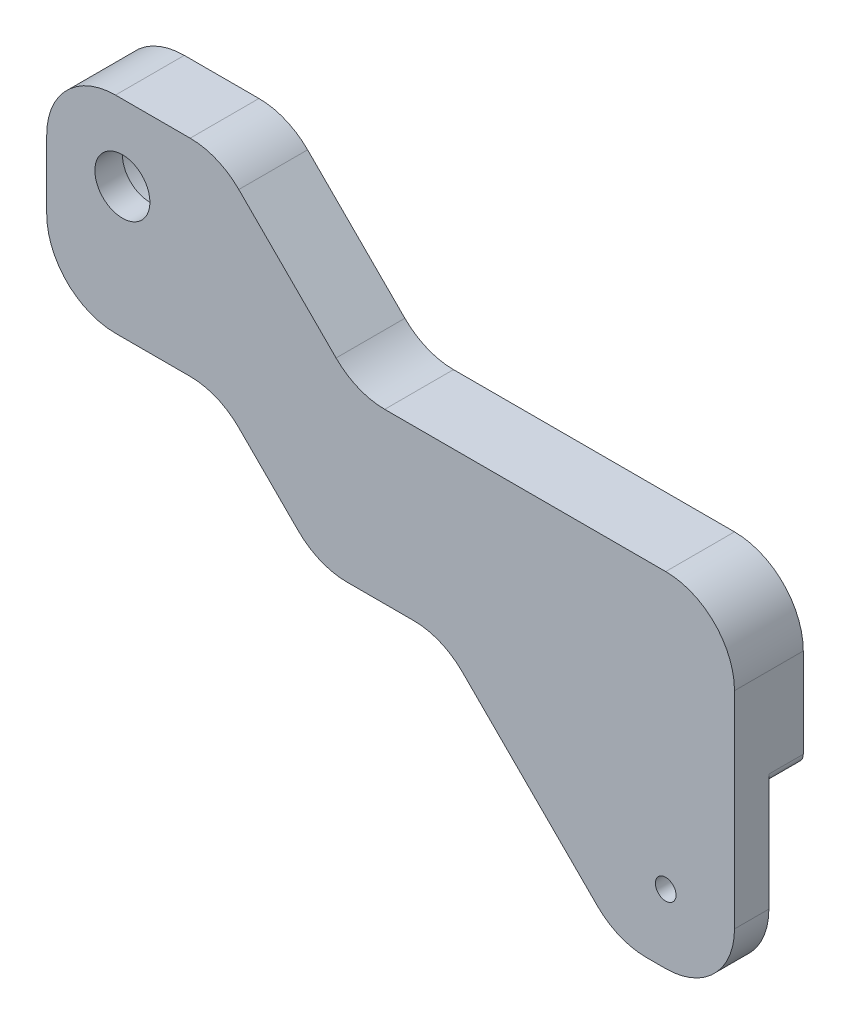
ISO-10303-21;
HEADER;
FILE_DESCRIPTION(('STEP AP214'),'2;1');
FILE_NAME('part.step','',(''),(''),'','','');
FILE_SCHEMA(('AUTOMOTIVE_DESIGN { 1 0 10303 214 1 1 1 1 }'));
ENDSEC;
DATA;
#1=APPLICATION_CONTEXT('core data for automotive mechanical design processes');
#2=APPLICATION_PROTOCOL_DEFINITION('international standard','automotive_design',2000,#1);
#3=PRODUCT_CONTEXT('',#1,'mechanical');
#4=PRODUCT('Part','Part','',(#3));
#5=PRODUCT_RELATED_PRODUCT_CATEGORY('part','',(#4));
#6=PRODUCT_DEFINITION_FORMATION('','',#4);
#7=PRODUCT_DEFINITION_CONTEXT('part definition',#1,'design');
#8=PRODUCT_DEFINITION('design','',#6,#7);
#9=PRODUCT_DEFINITION_SHAPE('','',#8);
#10=(LENGTH_UNIT() NAMED_UNIT(*) SI_UNIT(.MILLI.,.METRE.));
#11=(NAMED_UNIT(*) PLANE_ANGLE_UNIT() SI_UNIT($,.RADIAN.));
#12=(NAMED_UNIT(*) SI_UNIT($,.STERADIAN.) SOLID_ANGLE_UNIT());
#13=UNCERTAINTY_MEASURE_WITH_UNIT(LENGTH_MEASURE(1.E-05),#10,'distance_accuracy_value','');
#14=(GEOMETRIC_REPRESENTATION_CONTEXT(3) GLOBAL_UNCERTAINTY_ASSIGNED_CONTEXT((#13)) GLOBAL_UNIT_ASSIGNED_CONTEXT((#10,
#11,#12)) REPRESENTATION_CONTEXT('',''));
#15=CARTESIAN_POINT('',(0.,0.,0.));
#16=DIRECTION('',(0.,0.,1.));
#17=DIRECTION('',(1.,0.,0.));
#18=AXIS2_PLACEMENT_3D('',#15,#16,#17);
#19=CARTESIAN_POINT('',(22.,118.,20.));
#20=DIRECTION('',(0.,0.,-1.));
#21=DIRECTION('',(-1.,0.,0.));
#22=AXIS2_PLACEMENT_3D('',#19,#20,#21);
#23=CYLINDRICAL_SURFACE('',#22,8.00000000000001);
#24=CARTESIAN_POINT('',(22.,118.,20.));
#25=DIRECTION('',(0.,0.,-1.));
#26=DIRECTION('',(-1.,0.,0.));
#27=AXIS2_PLACEMENT_3D('',#24,#25,#26);
#28=CIRCLE('',#27,8.00000000000001);
#29=CARTESIAN_POINT('',(14.,118.,20.));
#30=VERTEX_POINT('',#29);
#31=EDGE_CURVE('E256',#30,#30,#28,.T.);
#32=ORIENTED_EDGE('',*,*,#31,.F.);
#33=EDGE_LOOP('',(#32));
#34=FACE_BOUND('',#33,.T.);
#35=CARTESIAN_POINT('',(22.,118.,12.));
#36=DIRECTION('',(0.,0.,-1.));
#37=DIRECTION('',(-1.,0.,0.));
#38=AXIS2_PLACEMENT_3D('',#35,#36,#37);
#39=CIRCLE('',#38,8.00000000000001);
#40=CARTESIAN_POINT('',(14.,118.,12.));
#41=VERTEX_POINT('',#40);
#42=EDGE_CURVE('E253',#41,#41,#39,.F.);
#43=ORIENTED_EDGE('',*,*,#42,.F.);
#44=EDGE_LOOP('',(#43));
#45=FACE_BOUND('',#44,.T.);
#46=ADVANCED_FACE('F33',(#34,#45),#23,.F.);
#47=CARTESIAN_POINT('',(0.,0.,20.));
#48=DIRECTION('',(1.,0.,0.));
#49=DIRECTION('',(0.,0.,-1.));
#50=AXIS2_PLACEMENT_3D('',#47,#48,#49);
#51=PLANE('',#50);
#52=DIRECTION('',(0.,-1.,0.));
#53=VECTOR('',#52,1.);
#54=CARTESIAN_POINT('',(0.,0.,20.));
#55=LINE('',#54,#53);
#56=CARTESIAN_POINT('',(0.,120.,20.));
#57=VERTEX_POINT('',#56);
#58=CARTESIAN_POINT('',(0.,100.,20.));
#59=VERTEX_POINT('',#58);
#60=EDGE_CURVE('E236',#57,#59,#55,.T.);
#61=ORIENTED_EDGE('',*,*,#60,.F.);
#62=DIRECTION('',(0.,0.,1.));
#63=VECTOR('',#62,1.);
#64=CARTESIAN_POINT('',(0.,120.,0.));
#65=LINE('',#64,#63);
#66=CARTESIAN_POINT('',(0.,120.,0.));
#67=VERTEX_POINT('',#66);
#68=EDGE_CURVE('E307',#57,#67,#65,.F.);
#69=ORIENTED_EDGE('',*,*,#68,.T.);
#70=DIRECTION('',(0.,-1.,0.));
#71=VECTOR('',#70,1.);
#72=CARTESIAN_POINT('',(0.,0.,0.));
#73=LINE('',#72,#71);
#74=CARTESIAN_POINT('',(0.,100.,0.));
#75=VERTEX_POINT('',#74);
#76=EDGE_CURVE('E235',#67,#75,#73,.T.);
#77=ORIENTED_EDGE('',*,*,#76,.T.);
#78=DIRECTION('',(0.,0.,1.));
#79=VECTOR('',#78,1.);
#80=CARTESIAN_POINT('',(0.,100.,20.));
#81=LINE('',#80,#79);
#82=EDGE_CURVE('E304',#75,#59,#81,.T.);
#83=ORIENTED_EDGE('',*,*,#82,.T.);
#84=EDGE_LOOP('',(#61,#69,#77,#83));
#85=FACE_BOUND('',#84,.T.);
#86=ADVANCED_FACE('F439',(#85),#51,.F.);
#87=CARTESIAN_POINT('',(0.,0.,20.));
#88=DIRECTION('',(0.,1.,0.));
#89=DIRECTION('',(0.,0.,1.));
#90=AXIS2_PLACEMENT_3D('',#87,#88,#89);
#91=PLANE('',#90);
#92=DIRECTION('',(-1.,0.,0.));
#93=VECTOR('',#92,1.);
#94=CARTESIAN_POINT('',(200.,0.,10.));
#95=LINE('',#94,#93);
#96=CARTESIAN_POINT('',(180.,0.,10.));
#97=VERTEX_POINT('',#96);
#98=CARTESIAN_POINT('',(174.284271247462,0.,10.));
#99=VERTEX_POINT('',#98);
#100=EDGE_CURVE('E214',#97,#99,#95,.T.);
#101=ORIENTED_EDGE('',*,*,#100,.F.);
#102=DIRECTION('',(0.,0.,-1.));
#103=VECTOR('',#102,1.);
#104=CARTESIAN_POINT('',(180.,0.,20.));
#105=LINE('',#104,#103);
#106=CARTESIAN_POINT('',(180.,0.,20.));
#107=VERTEX_POINT('',#106);
#108=EDGE_CURVE('E187',#97,#107,#105,.F.);
#109=ORIENTED_EDGE('',*,*,#108,.T.);
#110=DIRECTION('',(1.,0.,0.));
#111=VECTOR('',#110,1.);
#112=CARTESIAN_POINT('',(0.,0.,20.));
#113=LINE('',#112,#111);
#114=CARTESIAN_POINT('',(174.284271247462,0.,20.));
#115=VERTEX_POINT('',#114);
#116=EDGE_CURVE('E239',#115,#107,#113,.T.);
#117=ORIENTED_EDGE('',*,*,#116,.F.);
#118=DIRECTION('',(0.,0.,-1.));
#119=VECTOR('',#118,1.);
#120=CARTESIAN_POINT('',(174.284271247462,0.,20.));
#121=LINE('',#120,#119);
#122=EDGE_CURVE('E192',#115,#99,#121,.T.);
#123=ORIENTED_EDGE('',*,*,#122,.T.);
#124=EDGE_LOOP('',(#101,#109,#117,#123));
#125=FACE_BOUND('',#124,.T.);
#126=ADVANCED_FACE('F359',(#125),#91,.F.);
#127=CARTESIAN_POINT('',(200.,0.,20.));
#128=DIRECTION('',(-1.,0.,0.));
#129=DIRECTION('',(0.,0.,1.));
#130=AXIS2_PLACEMENT_3D('',#127,#128,#129);
#131=PLANE('',#130);
#132=DIRECTION('',(0.,-1.,0.));
#133=VECTOR('',#132,1.);
#134=CARTESIAN_POINT('',(200.,51.,10.));
#135=LINE('',#134,#133);
#136=CARTESIAN_POINT('',(200.,54.,10.));
#137=VERTEX_POINT('',#136);
#138=CARTESIAN_POINT('',(200.,20.,10.));
#139=VERTEX_POINT('',#138);
#140=EDGE_CURVE('E199',#137,#139,#135,.T.);
#141=ORIENTED_EDGE('',*,*,#140,.F.);
#142=DIRECTION('',(0.,0.,-1.));
#143=VECTOR('',#142,1.);
#144=CARTESIAN_POINT('',(200.,54.,20.));
#145=LINE('',#144,#143);
#146=CARTESIAN_POINT('',(200.,54.,0.));
#147=VERTEX_POINT('',#146);
#148=EDGE_CURVE('E341',#137,#147,#145,.T.);
#149=ORIENTED_EDGE('',*,*,#148,.T.);
#150=DIRECTION('',(0.,1.,0.));
#151=VECTOR('',#150,1.);
#152=CARTESIAN_POINT('',(200.,0.,0.));
#153=LINE('',#152,#151);
#154=CARTESIAN_POINT('',(200.,80.,0.));
#155=VERTEX_POINT('',#154);
#156=EDGE_CURVE('E249',#147,#155,#153,.T.);
#157=ORIENTED_EDGE('',*,*,#156,.T.);
#158=DIRECTION('',(0.,0.,-1.));
#159=VECTOR('',#158,1.);
#160=CARTESIAN_POINT('',(200.,80.,20.));
#161=LINE('',#160,#159);
#162=CARTESIAN_POINT('',(200.,80.,20.));
#163=VERTEX_POINT('',#162);
#164=EDGE_CURVE('E202',#155,#163,#161,.F.);
#165=ORIENTED_EDGE('',*,*,#164,.T.);
#166=DIRECTION('',(0.,1.,0.));
#167=VECTOR('',#166,1.);
#168=CARTESIAN_POINT('',(200.,0.,20.));
#169=LINE('',#168,#167);
#170=CARTESIAN_POINT('',(200.,20.,20.));
#171=VERTEX_POINT('',#170);
#172=EDGE_CURVE('E201',#171,#163,#169,.T.);
#173=ORIENTED_EDGE('',*,*,#172,.F.);
#174=DIRECTION('',(0.,0.,-1.));
#175=VECTOR('',#174,1.);
#176=CARTESIAN_POINT('',(200.,20.,20.));
#177=LINE('',#176,#175);
#178=EDGE_CURVE('E186',#171,#139,#177,.T.);
#179=ORIENTED_EDGE('',*,*,#178,.T.);
#180=EDGE_LOOP('',(#141,#149,#157,#165,#173,#179));
#181=FACE_BOUND('',#180,.T.);
#182=ADVANCED_FACE('F197',(#181),#131,.F.);
#183=CARTESIAN_POINT('',(0.,100.,20.));
#184=DIRECTION('',(0.,-1.,0.));
#185=DIRECTION('',(0.,0.,-1.));
#186=AXIS2_PLACEMENT_3D('',#183,#184,#185);
#187=PLANE('',#186);
#188=DIRECTION('',(-1.,0.,0.));
#189=VECTOR('',#188,1.);
#190=CARTESIAN_POINT('',(0.,100.,20.));
#191=LINE('',#190,#189);
#192=CARTESIAN_POINT('',(180.,100.,20.));
#193=VERTEX_POINT('',#192);
#194=CARTESIAN_POINT('',(98.2842712474618,100.,20.));
#195=VERTEX_POINT('',#194);
#196=EDGE_CURVE('E244',#193,#195,#191,.T.);
#197=ORIENTED_EDGE('',*,*,#196,.F.);
#198=DIRECTION('',(0.,0.,-1.));
#199=VECTOR('',#198,1.);
#200=CARTESIAN_POINT('',(180.,100.,20.));
#201=LINE('',#200,#199);
#202=CARTESIAN_POINT('',(180.,100.,0.));
#203=VERTEX_POINT('',#202);
#204=EDGE_CURVE('E280',#193,#203,#201,.T.);
#205=ORIENTED_EDGE('',*,*,#204,.T.);
#206=DIRECTION('',(-1.,0.,0.));
#207=VECTOR('',#206,1.);
#208=CARTESIAN_POINT('',(0.,100.,0.));
#209=LINE('',#208,#207);
#210=CARTESIAN_POINT('',(98.2842712474618,100.,0.));
#211=VERTEX_POINT('',#210);
#212=EDGE_CURVE('E240',#203,#211,#209,.T.);
#213=ORIENTED_EDGE('',*,*,#212,.T.);
#214=DIRECTION('',(0.,0.,1.));
#215=VECTOR('',#214,1.);
#216=CARTESIAN_POINT('',(98.2842712474618,100.,20.));
#217=LINE('',#216,#215);
#218=EDGE_CURVE('E277',#211,#195,#217,.T.);
#219=ORIENTED_EDGE('',*,*,#218,.T.);
#220=EDGE_LOOP('',(#197,#205,#213,#219));
#221=FACE_BOUND('',#220,.T.);
#222=ADVANCED_FACE('F434',(#221),#187,.F.);
#223=CARTESIAN_POINT('',(0.,0.,20.));
#224=DIRECTION('',(0.,0.,-1.));
#225=DIRECTION('',(-1.,0.,0.));
#226=AXIS2_PLACEMENT_3D('',#223,#224,#225);
#227=PLANE('',#226);
#228=ORIENTED_EDGE('',*,*,#31,.T.);
#229=EDGE_LOOP('',(#228));
#230=FACE_BOUND('',#229,.T.);
#231=CARTESIAN_POINT('',(180.,20.,20.));
#232=DIRECTION('',(0.,0.,-1.));
#233=DIRECTION('',(-1.,0.,0.));
#234=AXIS2_PLACEMENT_3D('',#231,#232,#233);
#235=CIRCLE('',#234,2.99999999999999);
#236=CARTESIAN_POINT('',(177.,20.,20.));
#237=VERTEX_POINT('',#236);
#238=EDGE_CURVE('E232',#237,#237,#235,.T.);
#239=ORIENTED_EDGE('',*,*,#238,.T.);
#240=EDGE_LOOP('',(#239));
#241=FACE_BOUND('',#240,.T.);
#242=ORIENTED_EDGE('',*,*,#116,.T.);
#243=CARTESIAN_POINT('',(180.,20.,20.));
#244=DIRECTION('',(0.,0.,-1.));
#245=DIRECTION('',(-1.,0.,0.));
#246=AXIS2_PLACEMENT_3D('',#243,#244,#245);
#247=CIRCLE('',#246,20.);
#248=EDGE_CURVE('E275',#107,#171,#247,.F.);
#249=ORIENTED_EDGE('',*,*,#248,.T.);
#250=ORIENTED_EDGE('',*,*,#172,.T.);
#251=CARTESIAN_POINT('',(180.,80.,20.));
#252=DIRECTION('',(0.,0.,-1.));
#253=DIRECTION('',(-1.,0.,0.));
#254=AXIS2_PLACEMENT_3D('',#251,#252,#253);
#255=CIRCLE('',#254,20.);
#256=EDGE_CURVE('E273',#163,#193,#255,.F.);
#257=ORIENTED_EDGE('',*,*,#256,.T.);
#258=ORIENTED_EDGE('',*,*,#196,.T.);
#259=CARTESIAN_POINT('',(98.2842712474618,120.,20.));
#260=DIRECTION('',(0.,0.,-1.));
#261=DIRECTION('',(-1.,0.,0.));
#262=AXIS2_PLACEMENT_3D('',#259,#260,#261);
#263=CIRCLE('',#262,20.);
#264=CARTESIAN_POINT('',(84.142135623731,105.857864376269,20.));
#265=VERTEX_POINT('',#264);
#266=EDGE_CURVE('E328',#195,#265,#263,.T.);
#267=ORIENTED_EDGE('',*,*,#266,.T.);
#268=DIRECTION('',(-0.707106781186551,0.707106781186544,0.));
#269=VECTOR('',#268,1.);
#270=CARTESIAN_POINT('',(90.,100.,20.));
#271=LINE('',#270,#269);
#272=CARTESIAN_POINT('',(55.8578643762686,134.142135623731,20.));
#273=VERTEX_POINT('',#272);
#274=EDGE_CURVE('E381',#265,#273,#271,.T.);
#275=ORIENTED_EDGE('',*,*,#274,.T.);
#276=CARTESIAN_POINT('',(41.7157287525377,120.,20.));
#277=DIRECTION('',(0.,0.,-1.));
#278=DIRECTION('',(-1.,0.,0.));
#279=AXIS2_PLACEMENT_3D('',#276,#277,#278);
#280=CIRCLE('',#279,20.);
#281=CARTESIAN_POINT('',(41.7157287525377,140.,20.));
#282=VERTEX_POINT('',#281);
#283=EDGE_CURVE('E271',#273,#282,#280,.F.);
#284=ORIENTED_EDGE('',*,*,#283,.T.);
#285=DIRECTION('',(-1.,0.,0.));
#286=VECTOR('',#285,1.);
#287=CARTESIAN_POINT('',(49.9999999999996,140.,20.));
#288=LINE('',#287,#286);
#289=CARTESIAN_POINT('',(20.,140.,20.));
#290=VERTEX_POINT('',#289);
#291=EDGE_CURVE('E377',#282,#290,#288,.T.);
#292=ORIENTED_EDGE('',*,*,#291,.T.);
#293=CARTESIAN_POINT('',(20.,120.,20.));
#294=DIRECTION('',(0.,0.,-1.));
#295=DIRECTION('',(-1.,0.,0.));
#296=AXIS2_PLACEMENT_3D('',#293,#294,#295);
#297=CIRCLE('',#296,20.);
#298=EDGE_CURVE('E269',#290,#57,#297,.F.);
#299=ORIENTED_EDGE('',*,*,#298,.T.);
#300=ORIENTED_EDGE('',*,*,#60,.T.);
#301=CARTESIAN_POINT('',(20.,100.,20.));
#302=DIRECTION('',(0.,0.,-1.));
#303=DIRECTION('',(-1.,0.,0.));
#304=AXIS2_PLACEMENT_3D('',#301,#302,#303);
#305=CIRCLE('',#304,20.);
#306=CARTESIAN_POINT('',(20.,80.,20.));
#307=VERTEX_POINT('',#306);
#308=EDGE_CURVE('E267',#59,#307,#305,.F.);
#309=ORIENTED_EDGE('',*,*,#308,.T.);
#310=DIRECTION('',(1.,0.,0.));
#311=VECTOR('',#310,1.);
#312=CARTESIAN_POINT('',(0.,80.,20.));
#313=LINE('',#312,#311);
#314=CARTESIAN_POINT('',(41.7157287525373,80.,20.));
#315=VERTEX_POINT('',#314);
#316=EDGE_CURVE('E229',#307,#315,#313,.T.);
#317=ORIENTED_EDGE('',*,*,#316,.T.);
#318=CARTESIAN_POINT('',(41.7157287525373,60.,20.));
#319=DIRECTION('',(0.,0.,-1.));
#320=DIRECTION('',(-1.,0.,0.));
#321=AXIS2_PLACEMENT_3D('',#318,#319,#320);
#322=CIRCLE('',#321,20.);
#323=CARTESIAN_POINT('',(55.8578643762682,74.1421356237311,20.));
#324=VERTEX_POINT('',#323);
#325=EDGE_CURVE('E332',#315,#324,#322,.T.);
#326=ORIENTED_EDGE('',*,*,#325,.T.);
#327=DIRECTION('',(0.707106781186551,-0.707106781186544,0.));
#328=VECTOR('',#327,1.);
#329=CARTESIAN_POINT('',(64.9999999999993,65.,20.));
#330=LINE('',#329,#328);
#331=CARTESIAN_POINT('',(73.1421356237304,56.857864376269,20.));
#332=VERTEX_POINT('',#331);
#333=EDGE_CURVE('E226',#324,#332,#330,.T.);
#334=ORIENTED_EDGE('',*,*,#333,.T.);
#335=CARTESIAN_POINT('',(87.2842712474613,71.,20.));
#336=DIRECTION('',(0.,0.,-1.));
#337=DIRECTION('',(-1.,0.,0.));
#338=AXIS2_PLACEMENT_3D('',#335,#336,#337);
#339=CIRCLE('',#338,20.);
#340=CARTESIAN_POINT('',(87.2842712474613,51.,20.));
#341=VERTEX_POINT('',#340);
#342=EDGE_CURVE('E265',#332,#341,#339,.F.);
#343=ORIENTED_EDGE('',*,*,#342,.T.);
#344=DIRECTION('',(1.,0.,0.));
#345=VECTOR('',#344,1.);
#346=CARTESIAN_POINT('',(114.999999999999,51.,20.));
#347=LINE('',#346,#345);
#348=CARTESIAN_POINT('',(106.715728752538,51.,20.));
#349=VERTEX_POINT('',#348);
#350=EDGE_CURVE('E371',#341,#349,#347,.T.);
#351=ORIENTED_EDGE('',*,*,#350,.T.);
#352=CARTESIAN_POINT('',(106.715728752538,31.,20.));
#353=DIRECTION('',(0.,0.,-1.));
#354=DIRECTION('',(-1.,0.,0.));
#355=AXIS2_PLACEMENT_3D('',#352,#353,#354);
#356=CIRCLE('',#355,20.);
#357=CARTESIAN_POINT('',(120.857864376269,45.142135623731,20.));
#358=VERTEX_POINT('',#357);
#359=EDGE_CURVE('E339',#349,#358,#356,.T.);
#360=ORIENTED_EDGE('',*,*,#359,.T.);
#361=DIRECTION('',(0.707106781186551,-0.707106781186544,0.));
#362=VECTOR('',#361,1.);
#363=CARTESIAN_POINT('',(166.,0.,20.));
#364=LINE('',#363,#362);
#365=CARTESIAN_POINT('',(160.142135623731,5.85786437626899,20.));
#366=VERTEX_POINT('',#365);
#367=EDGE_CURVE('E369',#358,#366,#364,.T.);
#368=ORIENTED_EDGE('',*,*,#367,.T.);
#369=CARTESIAN_POINT('',(174.284271247462,20.,20.));
#370=DIRECTION('',(0.,0.,-1.));
#371=DIRECTION('',(-1.,0.,0.));
#372=AXIS2_PLACEMENT_3D('',#369,#370,#371);
#373=CIRCLE('',#372,20.);
#374=EDGE_CURVE('E263',#366,#115,#373,.F.);
#375=ORIENTED_EDGE('',*,*,#374,.T.);
#376=EDGE_LOOP('',(#242,#249,#250,#257,#258,#267,#275,#284,#292,#299,#300,#309,#317,#326,#334,
#343,#351,#360,#368,#375));
#377=FACE_BOUND('',#376,.T.);
#378=ADVANCED_FACE('F352',(#230,#241,#377),#227,.F.);
#379=CARTESIAN_POINT('',(0.,0.,0.));
#380=DIRECTION('',(0.,0.,-1.));
#381=DIRECTION('',(-1.,0.,0.));
#382=AXIS2_PLACEMENT_3D('',#379,#380,#381);
#383=PLANE('',#382);
#384=CARTESIAN_POINT('',(22.,118.,0.));
#385=DIRECTION('',(0.,0.,-1.));
#386=DIRECTION('',(-1.,0.,0.));
#387=AXIS2_PLACEMENT_3D('',#384,#385,#386);
#388=CIRCLE('',#387,17.5);
#389=CARTESIAN_POINT('',(4.50000000000001,118.,0.));
#390=VERTEX_POINT('',#389);
#391=EDGE_CURVE('E389',#390,#390,#388,.T.);
#392=ORIENTED_EDGE('',*,*,#391,.F.);
#393=EDGE_LOOP('',(#392));
#394=FACE_BOUND('',#393,.T.);
#395=ORIENTED_EDGE('',*,*,#156,.F.);
#396=CARTESIAN_POINT('',(197.,54.,0.));
#397=DIRECTION('',(0.,0.,-1.));
#398=DIRECTION('',(-1.,0.,0.));
#399=AXIS2_PLACEMENT_3D('',#396,#397,#398);
#400=CIRCLE('',#399,3.);
#401=CARTESIAN_POINT('',(197.,51.,0.));
#402=VERTEX_POINT('',#401);
#403=EDGE_CURVE('E55',#147,#402,#400,.T.);
#404=ORIENTED_EDGE('',*,*,#403,.T.);
#405=DIRECTION('',(1.,0.,0.));
#406=VECTOR('',#405,1.);
#407=CARTESIAN_POINT('',(79.,51.,0.));
#408=LINE('',#407,#406);
#409=CARTESIAN_POINT('',(87.2842712474613,51.,0.));
#410=VERTEX_POINT('',#409);
#411=EDGE_CURVE('E218',#410,#402,#408,.T.);
#412=ORIENTED_EDGE('',*,*,#411,.F.);
#413=CARTESIAN_POINT('',(87.2842712474613,71.,0.));
#414=DIRECTION('',(0.,0.,-1.));
#415=DIRECTION('',(-1.,0.,0.));
#416=AXIS2_PLACEMENT_3D('',#413,#414,#415);
#417=CIRCLE('',#416,20.);
#418=CARTESIAN_POINT('',(73.1421356237304,56.857864376269,0.));
#419=VERTEX_POINT('',#418);
#420=EDGE_CURVE('E283',#410,#419,#417,.T.);
#421=ORIENTED_EDGE('',*,*,#420,.T.);
#422=DIRECTION('',(-0.707106781186551,0.707106781186544,0.));
#423=VECTOR('',#422,1.);
#424=CARTESIAN_POINT('',(130.,0.,0.));
#425=LINE('',#424,#423);
#426=CARTESIAN_POINT('',(55.8578643762681,74.142135623731,0.));
#427=VERTEX_POINT('',#426);
#428=EDGE_CURVE('E212',#419,#427,#425,.T.);
#429=ORIENTED_EDGE('',*,*,#428,.T.);
#430=CARTESIAN_POINT('',(41.7157287525373,60.,0.));
#431=DIRECTION('',(0.,0.,-1.));
#432=DIRECTION('',(-1.,0.,0.));
#433=AXIS2_PLACEMENT_3D('',#430,#431,#432);
#434=CIRCLE('',#433,20.);
#435=CARTESIAN_POINT('',(41.7157287525373,80.,0.));
#436=VERTEX_POINT('',#435);
#437=EDGE_CURVE('E334',#427,#436,#434,.F.);
#438=ORIENTED_EDGE('',*,*,#437,.T.);
#439=DIRECTION('',(-1.,0.,0.));
#440=VECTOR('',#439,1.);
#441=CARTESIAN_POINT('',(49.9999999999991,80.,0.));
#442=LINE('',#441,#440);
#443=CARTESIAN_POINT('',(20.,80.,0.));
#444=VERTEX_POINT('',#443);
#445=EDGE_CURVE('E223',#436,#444,#442,.T.);
#446=ORIENTED_EDGE('',*,*,#445,.T.);
#447=CARTESIAN_POINT('',(20.,100.,0.));
#448=DIRECTION('',(0.,0.,-1.));
#449=DIRECTION('',(-1.,0.,0.));
#450=AXIS2_PLACEMENT_3D('',#447,#448,#449);
#451=CIRCLE('',#450,20.);
#452=EDGE_CURVE('E285',#444,#75,#451,.T.);
#453=ORIENTED_EDGE('',*,*,#452,.T.);
#454=ORIENTED_EDGE('',*,*,#76,.F.);
#455=CARTESIAN_POINT('',(20.,120.,0.));
#456=DIRECTION('',(0.,0.,-1.));
#457=DIRECTION('',(-1.,0.,0.));
#458=AXIS2_PLACEMENT_3D('',#455,#456,#457);
#459=CIRCLE('',#458,20.);
#460=CARTESIAN_POINT('',(20.,140.,0.));
#461=VERTEX_POINT('',#460);
#462=EDGE_CURVE('E287',#67,#461,#459,.T.);
#463=ORIENTED_EDGE('',*,*,#462,.T.);
#464=DIRECTION('',(-1.,0.,0.));
#465=VECTOR('',#464,1.);
#466=CARTESIAN_POINT('',(49.9999999999996,140.,0.));
#467=LINE('',#466,#465);
#468=CARTESIAN_POINT('',(41.7157287525377,140.,0.));
#469=VERTEX_POINT('',#468);
#470=EDGE_CURVE('E376',#469,#461,#467,.T.);
#471=ORIENTED_EDGE('',*,*,#470,.F.);
#472=CARTESIAN_POINT('',(41.7157287525377,120.,0.));
#473=DIRECTION('',(0.,0.,-1.));
#474=DIRECTION('',(-1.,0.,0.));
#475=AXIS2_PLACEMENT_3D('',#472,#473,#474);
#476=CIRCLE('',#475,20.);
#477=CARTESIAN_POINT('',(55.8578643762686,134.142135623731,0.));
#478=VERTEX_POINT('',#477);
#479=EDGE_CURVE('E289',#469,#478,#476,.T.);
#480=ORIENTED_EDGE('',*,*,#479,.T.);
#481=DIRECTION('',(-0.707106781186551,0.707106781186544,0.));
#482=VECTOR('',#481,1.);
#483=CARTESIAN_POINT('',(90.,100.,0.));
#484=LINE('',#483,#482);
#485=CARTESIAN_POINT('',(84.142135623731,105.857864376269,0.));
#486=VERTEX_POINT('',#485);
#487=EDGE_CURVE('E380',#486,#478,#484,.T.);
#488=ORIENTED_EDGE('',*,*,#487,.F.);
#489=CARTESIAN_POINT('',(98.2842712474618,120.,0.));
#490=DIRECTION('',(0.,0.,-1.));
#491=DIRECTION('',(-1.,0.,0.));
#492=AXIS2_PLACEMENT_3D('',#489,#490,#491);
#493=CIRCLE('',#492,20.);
#494=EDGE_CURVE('E330',#486,#211,#493,.F.);
#495=ORIENTED_EDGE('',*,*,#494,.T.);
#496=ORIENTED_EDGE('',*,*,#212,.F.);
#497=CARTESIAN_POINT('',(180.,80.,0.));
#498=DIRECTION('',(0.,0.,-1.));
#499=DIRECTION('',(-1.,0.,0.));
#500=AXIS2_PLACEMENT_3D('',#497,#498,#499);
#501=CIRCLE('',#500,20.);
#502=EDGE_CURVE('E291',#203,#155,#501,.T.);
#503=ORIENTED_EDGE('',*,*,#502,.T.);
#504=EDGE_LOOP('',(#395,#404,#412,#421,#429,#438,#446,#453,#454,#463,#471,#480,#488,#495,#496,#503));
#505=FACE_BOUND('',#504,.T.);
#506=ADVANCED_FACE('F344',(#394,#505),#383,.T.);
#507=CARTESIAN_POINT('',(180.,20.,0.));
#508=DIRECTION('',(0.,0.,1.));
#509=DIRECTION('',(1.,0.,0.));
#510=AXIS2_PLACEMENT_3D('',#507,#508,#509);
#511=CYLINDRICAL_SURFACE('',#510,2.99999999999999);
#512=CARTESIAN_POINT('',(180.,20.,10.));
#513=DIRECTION('',(0.,0.,1.));
#514=DIRECTION('',(1.,0.,0.));
#515=AXIS2_PLACEMENT_3D('',#512,#513,#514);
#516=CIRCLE('',#515,2.99999999999999);
#517=CARTESIAN_POINT('',(183.,20.,10.));
#518=VERTEX_POINT('',#517);
#519=EDGE_CURVE('E208',#518,#518,#516,.F.);
#520=ORIENTED_EDGE('',*,*,#519,.T.);
#521=EDGE_LOOP('',(#520));
#522=FACE_BOUND('',#521,.T.);
#523=ORIENTED_EDGE('',*,*,#238,.F.);
#524=EDGE_LOOP('',(#523));
#525=FACE_BOUND('',#524,.T.);
#526=ADVANCED_FACE('F425',(#522,#525),#511,.F.);
#527=CARTESIAN_POINT('',(49.9999999999991,80.,0.));
#528=DIRECTION('',(0.,1.,0.));
#529=DIRECTION('',(-1.,0.,0.));
#530=AXIS2_PLACEMENT_3D('',#527,#528,#529);
#531=PLANE('',#530);
#532=ORIENTED_EDGE('',*,*,#316,.F.);
#533=DIRECTION('',(0.,0.,1.));
#534=VECTOR('',#533,1.);
#535=CARTESIAN_POINT('',(20.,80.,0.));
#536=LINE('',#535,#534);
#537=EDGE_CURVE('E312',#307,#444,#536,.F.);
#538=ORIENTED_EDGE('',*,*,#537,.T.);
#539=ORIENTED_EDGE('',*,*,#445,.F.);
#540=DIRECTION('',(0.,0.,1.));
#541=VECTOR('',#540,1.);
#542=CARTESIAN_POINT('',(41.7157287525373,80.,20.));
#543=LINE('',#542,#541);
#544=EDGE_CURVE('E309',#436,#315,#543,.T.);
#545=ORIENTED_EDGE('',*,*,#544,.T.);
#546=EDGE_LOOP('',(#532,#538,#539,#545));
#547=FACE_BOUND('',#546,.T.);
#548=ADVANCED_FACE('F431',(#547),#531,.F.);
#549=CARTESIAN_POINT('',(130.,0.,0.));
#550=DIRECTION('',(0.707106781186544,0.707106781186551,0.));
#551=DIRECTION('',(-0.707106781186551,0.707106781186544,0.));
#552=AXIS2_PLACEMENT_3D('',#549,#550,#551);
#553=PLANE('',#552);
#554=ORIENTED_EDGE('',*,*,#333,.F.);
#555=DIRECTION('',(0.,0.,1.));
#556=VECTOR('',#555,1.);
#557=CARTESIAN_POINT('',(55.8578643762681,74.142135623731,0.));
#558=LINE('',#557,#556);
#559=EDGE_CURVE('E316',#324,#427,#558,.F.);
#560=ORIENTED_EDGE('',*,*,#559,.T.);
#561=ORIENTED_EDGE('',*,*,#428,.F.);
#562=DIRECTION('',(0.,0.,-1.));
#563=VECTOR('',#562,1.);
#564=CARTESIAN_POINT('',(73.1421356237304,56.857864376269,0.));
#565=LINE('',#564,#563);
#566=EDGE_CURVE('E314',#419,#332,#565,.F.);
#567=ORIENTED_EDGE('',*,*,#566,.T.);
#568=EDGE_LOOP('',(#554,#560,#561,#567));
#569=FACE_BOUND('',#568,.T.);
#570=ADVANCED_FACE('F463',(#569),#553,.F.);
#571=CARTESIAN_POINT('',(0.,0.,10.));
#572=DIRECTION('',(0.,0.,1.));
#573=DIRECTION('',(1.,0.,0.));
#574=AXIS2_PLACEMENT_3D('',#571,#572,#573);
#575=PLANE('',#574);
#576=ORIENTED_EDGE('',*,*,#140,.T.);
#577=CARTESIAN_POINT('',(180.,20.,10.));
#578=DIRECTION('',(0.,0.,1.));
#579=DIRECTION('',(1.,0.,0.));
#580=AXIS2_PLACEMENT_3D('',#577,#578,#579);
#581=CIRCLE('',#580,20.);
#582=EDGE_CURVE('E182',#139,#97,#581,.F.);
#583=ORIENTED_EDGE('',*,*,#582,.T.);
#584=ORIENTED_EDGE('',*,*,#100,.T.);
#585=CARTESIAN_POINT('',(174.284271247462,20.,10.));
#586=DIRECTION('',(0.,0.,1.));
#587=DIRECTION('',(1.,0.,0.));
#588=AXIS2_PLACEMENT_3D('',#585,#586,#587);
#589=CIRCLE('',#588,20.);
#590=CARTESIAN_POINT('',(160.142135623731,5.85786437626899,10.));
#591=VERTEX_POINT('',#590);
#592=EDGE_CURVE('E193',#99,#591,#589,.F.);
#593=ORIENTED_EDGE('',*,*,#592,.T.);
#594=DIRECTION('',(-0.707106781186551,0.707106781186544,0.));
#595=VECTOR('',#594,1.);
#596=CARTESIAN_POINT('',(82.9999999999992,83.,10.));
#597=LINE('',#596,#595);
#598=CARTESIAN_POINT('',(120.857864376269,45.142135623731,10.));
#599=VERTEX_POINT('',#598);
#600=EDGE_CURVE('E219',#591,#599,#597,.T.);
#601=ORIENTED_EDGE('',*,*,#600,.T.);
#602=CARTESIAN_POINT('',(106.715728752538,31.,10.));
#603=DIRECTION('',(0.,0.,1.));
#604=DIRECTION('',(1.,0.,0.));
#605=AXIS2_PLACEMENT_3D('',#602,#603,#604);
#606=CIRCLE('',#605,20.);
#607=CARTESIAN_POINT('',(106.715728752538,51.,10.));
#608=VERTEX_POINT('',#607);
#609=EDGE_CURVE('E336',#599,#608,#606,.T.);
#610=ORIENTED_EDGE('',*,*,#609,.T.);
#611=DIRECTION('',(1.,0.,0.));
#612=VECTOR('',#611,1.);
#613=CARTESIAN_POINT('',(79.,51.,10.));
#614=LINE('',#613,#612);
#615=CARTESIAN_POINT('',(197.,51.,10.));
#616=VERTEX_POINT('',#615);
#617=EDGE_CURVE('E209',#608,#616,#614,.T.);
#618=ORIENTED_EDGE('',*,*,#617,.T.);
#619=CARTESIAN_POINT('',(197.,54.,10.));
#620=DIRECTION('',(0.,0.,1.));
#621=DIRECTION('',(1.,0.,0.));
#622=AXIS2_PLACEMENT_3D('',#619,#620,#621);
#623=CIRCLE('',#622,3.);
#624=EDGE_CURVE('E11',#616,#137,#623,.T.);
#625=ORIENTED_EDGE('',*,*,#624,.T.);
#626=EDGE_LOOP('',(#576,#583,#584,#593,#601,#610,#618,#625));
#627=FACE_BOUND('',#626,.T.);
#628=ORIENTED_EDGE('',*,*,#519,.F.);
#629=EDGE_LOOP('',(#628));
#630=FACE_BOUND('',#629,.T.);
#631=ADVANCED_FACE('F204',(#627,#630),#575,.F.);
#632=CARTESIAN_POINT('',(79.,51.,10.));
#633=DIRECTION('',(0.,1.,0.));
#634=DIRECTION('',(-1.,0.,0.));
#635=AXIS2_PLACEMENT_3D('',#632,#633,#634);
#636=PLANE('',#635);
#637=ORIENTED_EDGE('',*,*,#411,.T.);
#638=DIRECTION('',(0.,0.,-1.));
#639=VECTOR('',#638,1.);
#640=CARTESIAN_POINT('',(197.,51.,10.));
#641=LINE('',#640,#639);
#642=EDGE_CURVE('E41',#402,#616,#641,.F.);
#643=ORIENTED_EDGE('',*,*,#642,.T.);
#644=ORIENTED_EDGE('',*,*,#617,.F.);
#645=DIRECTION('',(0.,0.,-1.));
#646=VECTOR('',#645,1.);
#647=CARTESIAN_POINT('',(106.715728752538,51.,20.));
#648=LINE('',#647,#646);
#649=EDGE_CURVE('E318',#608,#349,#648,.F.);
#650=ORIENTED_EDGE('',*,*,#649,.T.);
#651=ORIENTED_EDGE('',*,*,#350,.F.);
#652=DIRECTION('',(0.,0.,-1.));
#653=VECTOR('',#652,1.);
#654=CARTESIAN_POINT('',(87.2842712474613,51.,10.));
#655=LINE('',#654,#653);
#656=EDGE_CURVE('E320',#341,#410,#655,.T.);
#657=ORIENTED_EDGE('',*,*,#656,.T.);
#658=EDGE_LOOP('',(#637,#643,#644,#650,#651,#657));
#659=FACE_BOUND('',#658,.T.);
#660=ADVANCED_FACE('F460',(#659),#636,.F.);
#661=CARTESIAN_POINT('',(166.,0.,20.));
#662=DIRECTION('',(0.707106781186544,0.707106781186551,0.));
#663=DIRECTION('',(-0.707106781186551,0.707106781186544,0.));
#664=AXIS2_PLACEMENT_3D('',#661,#662,#663);
#665=PLANE('',#664);
#666=ORIENTED_EDGE('',*,*,#367,.F.);
#667=DIRECTION('',(0.,0.,-1.));
#668=VECTOR('',#667,1.);
#669=CARTESIAN_POINT('',(120.857864376269,45.142135623731,10.));
#670=LINE('',#669,#668);
#671=EDGE_CURVE('E325',#358,#599,#670,.T.);
#672=ORIENTED_EDGE('',*,*,#671,.T.);
#673=ORIENTED_EDGE('',*,*,#600,.F.);
#674=DIRECTION('',(0.,0.,-1.));
#675=VECTOR('',#674,1.);
#676=CARTESIAN_POINT('',(160.142135623731,5.85786437626899,20.));
#677=LINE('',#676,#675);
#678=EDGE_CURVE('E323',#591,#366,#677,.F.);
#679=ORIENTED_EDGE('',*,*,#678,.T.);
#680=EDGE_LOOP('',(#666,#672,#673,#679));
#681=FACE_BOUND('',#680,.T.);
#682=ADVANCED_FACE('F367',(#681),#665,.F.);
#683=CARTESIAN_POINT('',(49.9999999999996,140.,0.));
#684=DIRECTION('',(0.,1.,0.));
#685=DIRECTION('',(0.,0.,1.));
#686=AXIS2_PLACEMENT_3D('',#683,#684,#685);
#687=PLANE('',#686);
#688=ORIENTED_EDGE('',*,*,#291,.F.);
#689=DIRECTION('',(0.,0.,1.));
#690=VECTOR('',#689,1.);
#691=CARTESIAN_POINT('',(41.7157287525377,140.,0.));
#692=LINE('',#691,#690);
#693=EDGE_CURVE('E302',#282,#469,#692,.F.);
#694=ORIENTED_EDGE('',*,*,#693,.T.);
#695=ORIENTED_EDGE('',*,*,#470,.T.);
#696=DIRECTION('',(0.,0.,1.));
#697=VECTOR('',#696,1.);
#698=CARTESIAN_POINT('',(20.,140.,20.));
#699=LINE('',#698,#697);
#700=EDGE_CURVE('E299',#461,#290,#699,.T.);
#701=ORIENTED_EDGE('',*,*,#700,.T.);
#702=EDGE_LOOP('',(#688,#694,#695,#701));
#703=FACE_BOUND('',#702,.T.);
#704=ADVANCED_FACE('F451',(#703),#687,.T.);
#705=CARTESIAN_POINT('',(90.,100.,0.));
#706=DIRECTION('',(0.707106781186544,0.707106781186551,0.));
#707=DIRECTION('',(-0.707106781186551,0.707106781186544,0.));
#708=AXIS2_PLACEMENT_3D('',#705,#706,#707);
#709=PLANE('',#708);
#710=ORIENTED_EDGE('',*,*,#274,.F.);
#711=DIRECTION('',(0.,0.,1.));
#712=VECTOR('',#711,1.);
#713=CARTESIAN_POINT('',(84.142135623731,105.857864376269,0.));
#714=LINE('',#713,#712);
#715=EDGE_CURVE('E297',#265,#486,#714,.F.);
#716=ORIENTED_EDGE('',*,*,#715,.T.);
#717=ORIENTED_EDGE('',*,*,#487,.T.);
#718=DIRECTION('',(0.,0.,1.));
#719=VECTOR('',#718,1.);
#720=CARTESIAN_POINT('',(55.8578643762686,134.142135623731,0.));
#721=LINE('',#720,#719);
#722=EDGE_CURVE('E294',#478,#273,#721,.T.);
#723=ORIENTED_EDGE('',*,*,#722,.T.);
#724=EDGE_LOOP('',(#710,#716,#717,#723));
#725=FACE_BOUND('',#724,.T.);
#726=ADVANCED_FACE('F420',(#725),#709,.T.);
#727=CARTESIAN_POINT('',(22.,118.,11.));
#728=DIRECTION('',(0.,0.,-1.));
#729=DIRECTION('',(-1.,0.,0.));
#730=AXIS2_PLACEMENT_3D('',#727,#728,#729);
#731=CYLINDRICAL_SURFACE('',#730,17.5);
#732=CARTESIAN_POINT('',(22.,118.,11.));
#733=DIRECTION('',(0.,0.,-1.));
#734=DIRECTION('',(-1.,0.,0.));
#735=AXIS2_PLACEMENT_3D('',#732,#733,#734);
#736=CIRCLE('',#735,17.5);
#737=CARTESIAN_POINT('',(4.50000000000001,118.,11.));
#738=VERTEX_POINT('',#737);
#739=EDGE_CURVE('E384',#738,#738,#736,.T.);
#740=ORIENTED_EDGE('',*,*,#739,.F.);
#741=EDGE_LOOP('',(#740));
#742=FACE_BOUND('',#741,.T.);
#743=ORIENTED_EDGE('',*,*,#391,.T.);
#744=EDGE_LOOP('',(#743));
#745=FACE_BOUND('',#744,.T.);
#746=ADVANCED_FACE('F414',(#742,#745),#731,.F.);
#747=CARTESIAN_POINT('',(22.,118.,11.));
#748=DIRECTION('',(0.,0.,-1.));
#749=DIRECTION('',(-1.,0.,0.));
#750=AXIS2_PLACEMENT_3D('',#747,#748,#749);
#751=PLANE('',#750);
#752=CARTESIAN_POINT('',(22.,118.,11.));
#753=DIRECTION('',(0.,0.,-1.));
#754=DIRECTION('',(-1.,0.,0.));
#755=AXIS2_PLACEMENT_3D('',#752,#753,#754);
#756=CIRCLE('',#755,14.5);
#757=CARTESIAN_POINT('',(7.50000000000001,118.,11.));
#758=VERTEX_POINT('',#757);
#759=EDGE_CURVE('E396',#758,#758,#756,.T.);
#760=ORIENTED_EDGE('',*,*,#759,.F.);
#761=EDGE_LOOP('',(#760));
#762=FACE_BOUND('',#761,.T.);
#763=ORIENTED_EDGE('',*,*,#739,.T.);
#764=EDGE_LOOP('',(#763));
#765=FACE_BOUND('',#764,.T.);
#766=ADVANCED_FACE('F411',(#762,#765),#751,.T.);
#767=CARTESIAN_POINT('',(22.,118.,12.));
#768=DIRECTION('',(0.,0.,-1.));
#769=DIRECTION('',(-1.,0.,0.));
#770=AXIS2_PLACEMENT_3D('',#767,#768,#769);
#771=PLANE('',#770);
#772=CARTESIAN_POINT('',(22.,118.,12.));
#773=DIRECTION('',(0.,0.,-1.));
#774=DIRECTION('',(-1.,0.,0.));
#775=AXIS2_PLACEMENT_3D('',#772,#773,#774);
#776=CIRCLE('',#775,14.5);
#777=CARTESIAN_POINT('',(7.50000000000001,118.,12.));
#778=VERTEX_POINT('',#777);
#779=EDGE_CURVE('E257',#778,#778,#776,.T.);
#780=ORIENTED_EDGE('',*,*,#779,.T.);
#781=EDGE_LOOP('',(#780));
#782=FACE_BOUND('',#781,.T.);
#783=ORIENTED_EDGE('',*,*,#42,.T.);
#784=EDGE_LOOP('',(#783));
#785=FACE_BOUND('',#784,.T.);
#786=ADVANCED_FACE('F402',(#782,#785),#771,.T.);
#787=CARTESIAN_POINT('',(22.,118.,12.));
#788=DIRECTION('',(0.,0.,-1.));
#789=DIRECTION('',(-1.,0.,0.));
#790=AXIS2_PLACEMENT_3D('',#787,#788,#789);
#791=CYLINDRICAL_SURFACE('',#790,14.5);
#792=ORIENTED_EDGE('',*,*,#779,.F.);
#793=EDGE_LOOP('',(#792));
#794=FACE_BOUND('',#793,.T.);
#795=ORIENTED_EDGE('',*,*,#759,.T.);
#796=EDGE_LOOP('',(#795));
#797=FACE_BOUND('',#796,.T.);
#798=ADVANCED_FACE('F405',(#794,#797),#791,.F.);
#799=CARTESIAN_POINT('',(180.,20.,20.));
#800=DIRECTION('',(0.,0.,-1.));
#801=DIRECTION('',(-1.,0.,0.));
#802=AXIS2_PLACEMENT_3D('',#799,#800,#801);
#803=CYLINDRICAL_SURFACE('',#802,20.);
#804=ORIENTED_EDGE('',*,*,#248,.F.);
#805=ORIENTED_EDGE('',*,*,#108,.F.);
#806=ORIENTED_EDGE('',*,*,#582,.F.);
#807=ORIENTED_EDGE('',*,*,#178,.F.);
#808=EDGE_LOOP('',(#804,#805,#806,#807));
#809=FACE_BOUND('',#808,.T.);
#810=ADVANCED_FACE('F185',(#809),#803,.T.);
#811=CARTESIAN_POINT('',(180.,80.,20.));
#812=DIRECTION('',(0.,0.,-1.));
#813=DIRECTION('',(-1.,0.,0.));
#814=AXIS2_PLACEMENT_3D('',#811,#812,#813);
#815=CYLINDRICAL_SURFACE('',#814,20.);
#816=ORIENTED_EDGE('',*,*,#256,.F.);
#817=ORIENTED_EDGE('',*,*,#164,.F.);
#818=ORIENTED_EDGE('',*,*,#502,.F.);
#819=ORIENTED_EDGE('',*,*,#204,.F.);
#820=EDGE_LOOP('',(#816,#817,#818,#819));
#821=FACE_BOUND('',#820,.T.);
#822=ADVANCED_FACE('F350',(#821),#815,.T.);
#823=CARTESIAN_POINT('',(98.2842712474618,120.,20.));
#824=DIRECTION('',(0.,0.,1.));
#825=DIRECTION('',(1.,0.,0.));
#826=AXIS2_PLACEMENT_3D('',#823,#824,#825);
#827=CYLINDRICAL_SURFACE('',#826,20.);
#828=ORIENTED_EDGE('',*,*,#494,.F.);
#829=ORIENTED_EDGE('',*,*,#715,.F.);
#830=ORIENTED_EDGE('',*,*,#266,.F.);
#831=ORIENTED_EDGE('',*,*,#218,.F.);
#832=EDGE_LOOP('',(#828,#829,#830,#831));
#833=FACE_BOUND('',#832,.T.);
#834=ADVANCED_FACE('F508',(#833),#827,.F.);
#835=CARTESIAN_POINT('',(41.7157287525377,120.,0.));
#836=DIRECTION('',(0.,0.,1.));
#837=DIRECTION('',(1.,0.,0.));
#838=AXIS2_PLACEMENT_3D('',#835,#836,#837);
#839=CYLINDRICAL_SURFACE('',#838,20.);
#840=ORIENTED_EDGE('',*,*,#479,.F.);
#841=ORIENTED_EDGE('',*,*,#693,.F.);
#842=ORIENTED_EDGE('',*,*,#283,.F.);
#843=ORIENTED_EDGE('',*,*,#722,.F.);
#844=EDGE_LOOP('',(#840,#841,#842,#843));
#845=FACE_BOUND('',#844,.T.);
#846=ADVANCED_FACE('F501',(#845),#839,.T.);
#847=CARTESIAN_POINT('',(20.,120.,0.));
#848=DIRECTION('',(0.,0.,-1.));
#849=DIRECTION('',(-1.,0.,0.));
#850=AXIS2_PLACEMENT_3D('',#847,#848,#849);
#851=CYLINDRICAL_SURFACE('',#850,20.);
#852=ORIENTED_EDGE('',*,*,#462,.F.);
#853=ORIENTED_EDGE('',*,*,#68,.F.);
#854=ORIENTED_EDGE('',*,*,#298,.F.);
#855=ORIENTED_EDGE('',*,*,#700,.F.);
#856=EDGE_LOOP('',(#852,#853,#854,#855));
#857=FACE_BOUND('',#856,.T.);
#858=ADVANCED_FACE('F494',(#857),#851,.T.);
#859=CARTESIAN_POINT('',(20.,100.,20.));
#860=DIRECTION('',(0.,0.,1.));
#861=DIRECTION('',(1.,0.,0.));
#862=AXIS2_PLACEMENT_3D('',#859,#860,#861);
#863=CYLINDRICAL_SURFACE('',#862,20.);
#864=ORIENTED_EDGE('',*,*,#452,.F.);
#865=ORIENTED_EDGE('',*,*,#537,.F.);
#866=ORIENTED_EDGE('',*,*,#308,.F.);
#867=ORIENTED_EDGE('',*,*,#82,.F.);
#868=EDGE_LOOP('',(#864,#865,#866,#867));
#869=FACE_BOUND('',#868,.T.);
#870=ADVANCED_FACE('F487',(#869),#863,.T.);
#871=CARTESIAN_POINT('',(41.7157287525373,60.,0.));
#872=DIRECTION('',(0.,0.,-1.));
#873=DIRECTION('',(-1.,0.,0.));
#874=AXIS2_PLACEMENT_3D('',#871,#872,#873);
#875=CYLINDRICAL_SURFACE('',#874,20.);
#876=ORIENTED_EDGE('',*,*,#437,.F.);
#877=ORIENTED_EDGE('',*,*,#559,.F.);
#878=ORIENTED_EDGE('',*,*,#325,.F.);
#879=ORIENTED_EDGE('',*,*,#544,.F.);
#880=EDGE_LOOP('',(#876,#877,#878,#879));
#881=FACE_BOUND('',#880,.T.);
#882=ADVANCED_FACE('F480',(#881),#875,.F.);
#883=CARTESIAN_POINT('',(87.2842712474613,71.,10.));
#884=DIRECTION('',(0.,0.,-1.));
#885=DIRECTION('',(-1.,0.,0.));
#886=AXIS2_PLACEMENT_3D('',#883,#884,#885);
#887=CYLINDRICAL_SURFACE('',#886,20.);
#888=ORIENTED_EDGE('',*,*,#342,.F.);
#889=ORIENTED_EDGE('',*,*,#566,.F.);
#890=ORIENTED_EDGE('',*,*,#420,.F.);
#891=ORIENTED_EDGE('',*,*,#656,.F.);
#892=EDGE_LOOP('',(#888,#889,#890,#891));
#893=FACE_BOUND('',#892,.T.);
#894=ADVANCED_FACE('F533',(#893),#887,.T.);
#895=CARTESIAN_POINT('',(106.715728752538,31.,20.));
#896=DIRECTION('',(0.,0.,1.));
#897=DIRECTION('',(1.,0.,0.));
#898=AXIS2_PLACEMENT_3D('',#895,#896,#897);
#899=CYLINDRICAL_SURFACE('',#898,20.);
#900=ORIENTED_EDGE('',*,*,#359,.F.);
#901=ORIENTED_EDGE('',*,*,#649,.F.);
#902=ORIENTED_EDGE('',*,*,#609,.F.);
#903=ORIENTED_EDGE('',*,*,#671,.F.);
#904=EDGE_LOOP('',(#900,#901,#902,#903));
#905=FACE_BOUND('',#904,.T.);
#906=ADVANCED_FACE('F536',(#905),#899,.F.);
#907=CARTESIAN_POINT('',(174.284271247462,20.,20.));
#908=DIRECTION('',(0.,0.,-1.));
#909=DIRECTION('',(-1.,0.,0.));
#910=AXIS2_PLACEMENT_3D('',#907,#908,#909);
#911=CYLINDRICAL_SURFACE('',#910,20.);
#912=ORIENTED_EDGE('',*,*,#374,.F.);
#913=ORIENTED_EDGE('',*,*,#678,.F.);
#914=ORIENTED_EDGE('',*,*,#592,.F.);
#915=ORIENTED_EDGE('',*,*,#122,.F.);
#916=EDGE_LOOP('',(#912,#913,#914,#915));
#917=FACE_BOUND('',#916,.T.);
#918=ADVANCED_FACE('F361',(#917),#911,.T.);
#919=CARTESIAN_POINT('',(197.,54.,20.));
#920=DIRECTION('',(0.,0.,-1.));
#921=DIRECTION('',(-1.,0.,0.));
#922=AXIS2_PLACEMENT_3D('',#919,#920,#921);
#923=CYLINDRICAL_SURFACE('',#922,3.);
#924=ORIENTED_EDGE('',*,*,#624,.F.);
#925=ORIENTED_EDGE('',*,*,#642,.F.);
#926=ORIENTED_EDGE('',*,*,#403,.F.);
#927=ORIENTED_EDGE('',*,*,#148,.F.);
#928=EDGE_LOOP('',(#924,#925,#926,#927));
#929=FACE_BOUND('',#928,.T.);
#930=ADVANCED_FACE('F35',(#929),#923,.T.);
#931=CLOSED_SHELL('',(#46,#86,#126,#182,#222,#378,#506,#526,#548,#570,#631,#660,#682,#704,#726,
#746,#766,#786,#798,#810,#822,#834,#846,#858,#870,#882,#894,#906,#918,#930));
#932=MANIFOLD_SOLID_BREP('B2',#931);
#933=ADVANCED_BREP_SHAPE_REPRESENTATION('',(#18,#932),#14);
#934=SHAPE_DEFINITION_REPRESENTATION(#9,#933);
ENDSEC;
END-ISO-10303-21;
